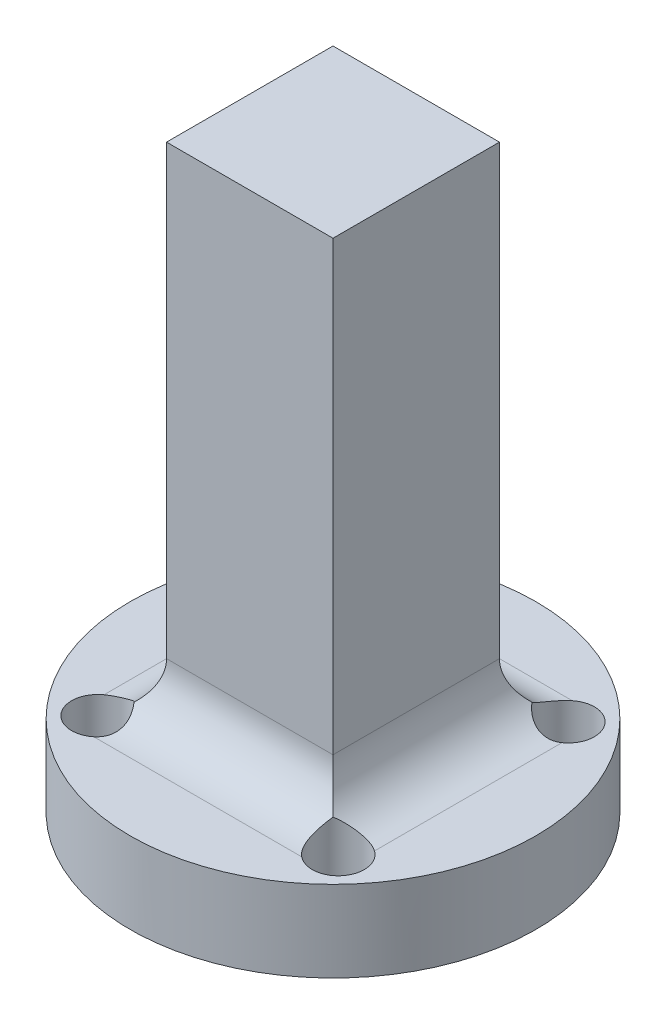
ISO-10303-21;
HEADER;
FILE_DESCRIPTION(('STEP AP214'),'2;1');
FILE_NAME('part.step','',(''),(''),'','','');
FILE_SCHEMA(('AUTOMOTIVE_DESIGN { 1 0 10303 214 1 1 1 1 }'));
ENDSEC;
DATA;
#1=APPLICATION_CONTEXT('core data for automotive mechanical design processes');
#2=APPLICATION_PROTOCOL_DEFINITION('international standard','automotive_design',2000,#1);
#3=PRODUCT_CONTEXT('',#1,'mechanical');
#4=PRODUCT('Part','Part','',(#3));
#5=PRODUCT_RELATED_PRODUCT_CATEGORY('part','',(#4));
#6=PRODUCT_DEFINITION_FORMATION('','',#4);
#7=PRODUCT_DEFINITION_CONTEXT('part definition',#1,'design');
#8=PRODUCT_DEFINITION('design','',#6,#7);
#9=PRODUCT_DEFINITION_SHAPE('','',#8);
#10=(LENGTH_UNIT() NAMED_UNIT(*) SI_UNIT(.MILLI.,.METRE.));
#11=(NAMED_UNIT(*) PLANE_ANGLE_UNIT() SI_UNIT($,.RADIAN.));
#12=(NAMED_UNIT(*) SI_UNIT($,.STERADIAN.) SOLID_ANGLE_UNIT());
#13=UNCERTAINTY_MEASURE_WITH_UNIT(LENGTH_MEASURE(1.E-05),#10,'distance_accuracy_value','');
#14=(GEOMETRIC_REPRESENTATION_CONTEXT(3) GLOBAL_UNCERTAINTY_ASSIGNED_CONTEXT((#13)) GLOBAL_UNIT_ASSIGNED_CONTEXT((#10,
#11,#12)) REPRESENTATION_CONTEXT('',''));
#15=CARTESIAN_POINT('',(0.,0.,0.));
#16=DIRECTION('',(0.,0.,1.));
#17=DIRECTION('',(1.,0.,0.));
#18=AXIS2_PLACEMENT_3D('',#15,#16,#17);
#19=CARTESIAN_POINT('',(-5.78230037987863,2.,5.5285624096012));
#20=DIRECTION('',(0.,-1.,0.));
#21=DIRECTION('',(0.,0.,-1.));
#22=AXIS2_PLACEMENT_3D('',#19,#20,#21);
#23=CYLINDRICAL_SURFACE('',#22,1.25);
#24=CARTESIAN_POINT('',(-4.99565623672356,2.,6.5));
#25=CARTESIAN_POINT('',(-4.96985241931316,2.00000089447943,6.47910472523633));
#26=CARTESIAN_POINT('',(-4.94489210961133,2.00026232413753,6.45718892597103));
#27=CARTESIAN_POINT('',(-4.89679623587124,2.00146362308063,6.41144708926393));
#28=CARTESIAN_POINT('',(-4.87366105928872,2.00240363599378,6.38762064836711));
#29=CARTESIAN_POINT('',(-4.80724898546659,2.0064755535342,6.3135226385259));
#30=CARTESIAN_POINT('',(-4.76692646416761,2.01085886778409,6.26060067381273));
#31=CARTESIAN_POINT('',(-4.69531472718749,2.02408136894734,6.1493302218496));
#32=CARTESIAN_POINT('',(-4.66404409457847,2.03292962148232,6.09097089191573));
#33=CARTESIAN_POINT('',(-4.61137937340525,2.05585298098622,5.9709759697923));
#34=CARTESIAN_POINT('',(-4.58997558676677,2.06992293090915,5.90934366134894));
#35=CARTESIAN_POINT('',(-4.55761996478952,2.10312794995213,5.78659920395023));
#36=CARTESIAN_POINT('',(-4.54640698499665,2.12211941240476,5.72551631633284));
#37=CARTESIAN_POINT('',(-4.53309400104578,2.16513330884828,5.60415045692307));
#38=CARTESIAN_POINT('',(-4.53099621670559,2.18915696683366,5.54386768354497));
#39=CARTESIAN_POINT('',(-4.53524091881413,2.24297118673254,5.42277139185705));
#40=CARTESIAN_POINT('',(-4.541996002102,2.27298426064981,5.36207289483123));
#41=CARTESIAN_POINT('',(-4.56356964264828,2.33717362021485,5.24433436149577));
#42=CARTESIAN_POINT('',(-4.57840332225154,2.37135762001575,5.18730141128557));
#43=CARTESIAN_POINT('',(-4.61857482386969,2.44995781209885,5.06701944074709));
#44=CARTESIAN_POINT('',(-4.64539765511264,2.49506894019033,5.00472952178863));
#45=CARTESIAN_POINT('',(-4.70727362014878,2.58820677948617,4.88733379238255));
#46=CARTESIAN_POINT('',(-4.7422841803158,2.63621748700351,4.83219303906777));
#47=CARTESIAN_POINT('',(-4.78070043003713,2.68505950821371,4.78070043003713));
#48=B_SPLINE_CURVE_WITH_KNOTS('',3,(#24,#25,#26,#27,#28,#29,#30,#31,#32,#33,#34,#35,#36,#37,#38,
#39,#40,#41,#42,#43,#44,#45,#46,#47),.UNSPECIFIED.,.F.,.F.,(4,2,2,2,2,2,2,2,2,2,2,4),(0.,
0.0995540797248653,0.199129237133235,0.398130421956338,0.597537294907428,0.796747751724287,
0.990696263075719,1.18469200393977,1.38805858887634,1.59180717127767,1.83531921738325,
2.07759217499231),.UNSPECIFIED.);
#49=CARTESIAN_POINT('',(-4.99565623672356,2.,6.5));
#50=VERTEX_POINT('',#49);
#51=CARTESIAN_POINT('',(-4.78070043003713,2.68505950821371,4.78070043003713));
#52=VERTEX_POINT('',#51);
#53=EDGE_CURVE('E84',#50,#52,#48,.T.);
#54=ORIENTED_EDGE('',*,*,#53,.T.);
#55=CARTESIAN_POINT('',(-4.78070043003713,2.6850595082137,4.78070043003713));
#56=CARTESIAN_POINT('',(-4.80840887173595,2.65879630191358,4.74362629248678));
#57=CARTESIAN_POINT('',(-4.8379610057044,2.63201997171276,4.70831049930148));
#58=CARTESIAN_POINT('',(-4.90065033943209,2.57807976399444,4.64125387019108));
#59=CARTESIAN_POINT('',(-4.93379117442149,2.55091551816711,4.6095167269938));
#60=CARTESIAN_POINT('',(-5.00369946260575,2.49673878442319,4.54957946762037));
#61=CARTESIAN_POINT('',(-5.04048673637458,2.46972807628843,4.52140081471615));
#62=CARTESIAN_POINT('',(-5.11737220333724,2.41660759674107,4.46906548107926));
#63=CARTESIAN_POINT('',(-5.15746844730047,2.3904973075882,4.44490645742981));
#64=CARTESIAN_POINT('',(-5.25941836219789,2.32838242018167,4.39113976092785));
#65=CARTESIAN_POINT('',(-5.32301865417972,2.29314091231148,4.3638861971722));
#66=CARTESIAN_POINT('',(-5.45583765770345,2.22729205813577,4.31992749241792));
#67=CARTESIAN_POINT('',(-5.52504155575247,2.19667306919968,4.30319550237738));
#68=CARTESIAN_POINT('',(-5.66826766108182,2.1411526880609,4.28165448136971));
#69=CARTESIAN_POINT('',(-5.74232624577992,2.11630283211407,4.27694942156137));
#70=CARTESIAN_POINT('',(-5.89216239854802,2.07377214302304,4.28115244890583));
#71=CARTESIAN_POINT('',(-5.9679395825944,2.05608972464961,4.29005752381093));
#72=CARTESIAN_POINT('',(-6.10757313423112,2.03011081438513,4.31980868342365));
#73=CARTESIAN_POINT('',(-6.17164351618286,2.02086194358416,4.33885680650206));
#74=CARTESIAN_POINT('',(-6.29630767958102,2.00752623387655,4.38718284928017));
#75=CARTESIAN_POINT('',(-6.3569071198215,2.003430750532,4.41644353251382));
#76=CARTESIAN_POINT('',(-6.42931071167543,2.00095631243706,4.45890526558474));
#77=CARTESIAN_POINT('',(-6.44372219105115,2.00059269598919,4.46775677548697));
#78=CARTESIAN_POINT('',(-6.47215201798542,2.00011506825862,4.48602307172673));
#79=CARTESIAN_POINT('',(-6.48617101490164,2.00000061728345,4.49543683565544));
#80=CARTESIAN_POINT('',(-6.5,2.,4.50513324484301));
#81=B_SPLINE_CURVE_WITH_KNOTS('',3,(#55,#56,#57,#58,#59,#60,#61,#62,#63,#64,#65,#66,#67,#68,#69,
#70,#71,#72,#73,#74,#75,#76,#77,#78,#79,#80),.UNSPECIFIED.,.F.,.F.,(4,2,2,2,2,2,2,2,2,2,2,2,4),
(0.,0.159569524294269,0.319302226415268,0.479956504565552,0.640516811784275,0.872473091903488,
1.10383503605461,1.33719041056538,1.57049414543997,1.77191796051389,1.97300344920204,
2.02374466510673,2.0743962671657),.UNSPECIFIED.);
#82=CARTESIAN_POINT('',(-6.5,2.,4.50513324484301));
#83=VERTEX_POINT('',#82);
#84=EDGE_CURVE('E76',#52,#83,#81,.T.);
#85=ORIENTED_EDGE('',*,*,#84,.T.);
#86=CARTESIAN_POINT('',(-5.78230037987863,2.,5.5285624096012));
#87=DIRECTION('',(0.,1.,0.));
#88=DIRECTION('',(0.,0.,1.));
#89=AXIS2_PLACEMENT_3D('',#86,#87,#88);
#90=CIRCLE('',#89,1.25);
#91=EDGE_CURVE('E203',#83,#50,#90,.T.);
#92=ORIENTED_EDGE('',*,*,#91,.T.);
#93=EDGE_LOOP('',(#54,#85,#92));
#94=FACE_BOUND('',#93,.T.);
#95=CARTESIAN_POINT('',(-5.78230037987863,-1.9,5.5285624096012));
#96=DIRECTION('',(0.,-1.,0.));
#97=DIRECTION('',(0.,0.,-1.));
#98=AXIS2_PLACEMENT_3D('',#95,#96,#97);
#99=CIRCLE('',#98,1.25);
#100=CARTESIAN_POINT('',(-5.78230037987863,-1.9,4.2785624096012));
#101=VERTEX_POINT('',#100);
#102=EDGE_CURVE('E369',#101,#101,#99,.T.);
#103=ORIENTED_EDGE('',*,*,#102,.T.);
#104=EDGE_LOOP('',(#103));
#105=FACE_BOUND('',#104,.T.);
#106=ADVANCED_FACE('F65',(#94,#105),#23,.F.);
#107=CARTESIAN_POINT('',(-5.78230037987863,2.,-5.5285624096012));
#108=DIRECTION('',(0.,-1.,0.));
#109=DIRECTION('',(0.,0.,-1.));
#110=AXIS2_PLACEMENT_3D('',#107,#108,#109);
#111=CYLINDRICAL_SURFACE('',#110,1.25);
#112=CARTESIAN_POINT('',(-5.78230037987863,2.,-5.5285624096012));
#113=DIRECTION('',(0.,1.,0.));
#114=DIRECTION('',(0.,0.,1.));
#115=AXIS2_PLACEMENT_3D('',#112,#113,#114);
#116=CIRCLE('',#115,1.25);
#117=CARTESIAN_POINT('',(-4.99565623672356,2.,-6.5));
#118=VERTEX_POINT('',#117);
#119=CARTESIAN_POINT('',(-6.5,2.,-4.50513324484301));
#120=VERTEX_POINT('',#119);
#121=EDGE_CURVE('E199',#118,#120,#116,.T.);
#122=ORIENTED_EDGE('',*,*,#121,.T.);
#123=CARTESIAN_POINT('',(-6.5,2.,-4.50513324484301));
#124=CARTESIAN_POINT('',(-6.47346985592118,1.99999915967387,-4.48652776902572));
#125=CARTESIAN_POINT('',(-6.44622516086038,2.00042297743986,-4.46896285745226));
#126=CARTESIAN_POINT('',(-6.39047635493586,2.00224437337088,-4.43600962820392));
#127=CARTESIAN_POINT('',(-6.36197206614527,2.00364208952068,-4.42062161933069));
#128=CARTESIAN_POINT('',(-6.27498608709423,2.00947259307293,-4.37794729015298));
#129=CARTESIAN_POINT('',(-6.21489239534751,2.01554146024035,-4.3540535512046));
#130=CARTESIAN_POINT('',(-6.09233253755923,2.03268484520465,-4.31591619054792));
#131=CARTESIAN_POINT('',(-6.02986298598155,2.04376677148884,-4.30168692950077));
#132=CARTESIAN_POINT('',(-5.9046259790634,2.0710836672523,-4.28295276003952));
#133=CARTESIAN_POINT('',(-5.84185863368645,2.08731686137717,-4.27844450550378));
#134=CARTESIAN_POINT('',(-5.71788284696649,2.12460884989841,-4.27868503691617));
#135=CARTESIAN_POINT('',(-5.65667317360885,2.14566368998921,-4.28342626105152));
#136=CARTESIAN_POINT('',(-5.53714948311199,2.19196315765343,-4.30134672165651));
#137=CARTESIAN_POINT('',(-5.47883704197607,2.21721003383421,-4.31453049761036));
#138=CARTESIAN_POINT('',(-5.36020482108183,2.27387631522092,-4.3501891738689));
#139=CARTESIAN_POINT('',(-5.30031232742372,2.30566507094854,-4.37349119763462));
#140=CARTESIAN_POINT('',(-5.18601322936874,2.37213169209834,-4.4281242321797));
#141=CARTESIAN_POINT('',(-5.13161332483706,2.40681299394012,-4.45946488745645));
#142=CARTESIAN_POINT('',(-5.02238745452157,2.48218397431905,-4.53361847206596));
#143=CARTESIAN_POINT('',(-4.96834183821837,2.52308607962147,-4.5773711400011));
#144=CARTESIAN_POINT('',(-4.89334510624871,2.5843530054958,-4.64910134380195));
#145=CARTESIAN_POINT('',(-4.86938267925849,2.60473710962755,-4.6739955542103));
#146=CARTESIAN_POINT('',(-4.82350016115877,2.64519941120578,-4.72582059294778));
#147=CARTESIAN_POINT('',(-4.8015797657085,2.66527765386301,-4.752751116701));
#148=CARTESIAN_POINT('',(-4.78070043003713,2.68505950821371,-4.78070043003713));
#149=B_SPLINE_CURVE_WITH_KNOTS('',3,(#123,#124,#125,#126,#127,#128,#129,#130,#131,#132,#133,
#134,#135,#136,#137,#138,#139,#140,#141,#142,#143,#144,#145,#146,#147,#148),.UNSPECIFIED.,.F.,
.F.,(4,2,2,2,2,2,2,2,2,2,2,2,4),(0.,0.0971578028756104,0.194329374151897,0.388170504885556,
0.582299041956374,0.776360746291051,0.970263864030677,1.16427132937533,1.37855765395605,
1.59310228502474,1.83419666646022,1.95446237006167,2.0747101207022),.UNSPECIFIED.);
#150=CARTESIAN_POINT('',(-4.78070043003713,2.68505950821371,-4.78070043003713));
#151=VERTEX_POINT('',#150);
#152=EDGE_CURVE('E12',#120,#151,#149,.T.);
#153=ORIENTED_EDGE('',*,*,#152,.T.);
#154=CARTESIAN_POINT('',(-4.78070043003713,2.68505950821371,-4.78070043003713));
#155=CARTESIAN_POINT('',(-4.7554667699924,2.65302295406572,-4.81451074484394));
#156=CARTESIAN_POINT('',(-4.73174291267654,2.62135568573,-4.84984083820133));
#157=CARTESIAN_POINT('',(-4.68761679142749,2.55907969023089,-4.92356249315505));
#158=CARTESIAN_POINT('',(-4.66722274824854,2.52847372555862,-4.96196129322965));
#159=CARTESIAN_POINT('',(-4.63004971128542,2.46858287594194,-5.04196723242474));
#160=CARTESIAN_POINT('',(-4.61329810952907,2.43930922764233,-5.08359568885544));
#161=CARTESIAN_POINT('',(-4.58409895645601,2.3827829701666,-5.16957224583006));
#162=CARTESIAN_POINT('',(-4.5716466233554,2.35552814227835,-5.21391725984838));
#163=CARTESIAN_POINT('',(-4.54802128649754,2.29426268012773,-5.32112572637707));
#164=CARTESIAN_POINT('',(-4.5388346675408,2.26124253389149,-5.38502177005327));
#165=CARTESIAN_POINT('',(-4.5306572033836,2.20075829143567,-5.51579658555106));
#166=CARTESIAN_POINT('',(-4.53163115421173,2.17327534735728,-5.5826642598322));
#167=CARTESIAN_POINT('',(-4.54486599031942,2.12433577998474,-5.71805970344683));
#168=CARTESIAN_POINT('',(-4.55720431902192,2.10292182517176,-5.78659571827544));
#169=CARTESIAN_POINT('',(-4.59384411854983,2.06665684027566,-5.92226922301116));
#170=CARTESIAN_POINT('',(-4.61815195034547,2.05180930776811,-5.98940594949696));
#171=CARTESIAN_POINT('',(-4.67553311326064,2.02938169553732,-6.11317867942084));
#172=CARTESIAN_POINT('',(-4.70755500752341,2.02124542735119,-6.1702064542832));
#173=CARTESIAN_POINT('',(-4.78036245552585,2.00920462103206,-6.27881868456151));
#174=CARTESIAN_POINT('',(-4.82114042823285,2.00529643977555,-6.33040779154143));
#175=CARTESIAN_POINT('',(-4.88589668879924,2.00189465676992,-6.4002549751359));
#176=CARTESIAN_POINT('',(-4.90687251425026,2.00115568971361,-6.42131688078703));
#177=CARTESIAN_POINT('',(-4.95022865822967,2.00020939243347,-6.46185426086648));
#178=CARTESIAN_POINT('',(-4.97260573414089,2.00000087811713,-6.4813331745606));
#179=CARTESIAN_POINT('',(-4.99565623672356,2.,-6.5));
#180=B_SPLINE_CURVE_WITH_KNOTS('',3,(#154,#155,#156,#157,#158,#159,#160,#161,#162,#163,#164,
#165,#166,#167,#168,#169,#170,#171,#172,#173,#174,#175,#176,#177,#178,#179),.UNSPECIFIED.,.F.,
.F.,(4,2,2,2,2,2,2,2,2,2,2,2,4),(0.,0.158917221313353,0.318221036646506,0.478684323807531,
0.638968559250836,0.85556373015362,1.07140869995011,1.28873553197597,1.50617798316154,
1.70297418622392,1.89960068480502,1.98873789264574,2.07767595044729),.UNSPECIFIED.);
#181=EDGE_CURVE('E243',#151,#118,#180,.T.);
#182=ORIENTED_EDGE('',*,*,#181,.T.);
#183=EDGE_LOOP('',(#122,#153,#182));
#184=FACE_BOUND('',#183,.T.);
#185=CARTESIAN_POINT('',(-5.78230037987863,-1.9,-5.5285624096012));
#186=DIRECTION('',(0.,-1.,0.));
#187=DIRECTION('',(0.,0.,-1.));
#188=AXIS2_PLACEMENT_3D('',#185,#186,#187);
#189=CIRCLE('',#188,1.25);
#190=CARTESIAN_POINT('',(-5.78230037987863,-1.9,-6.7785624096012));
#191=VERTEX_POINT('',#190);
#192=EDGE_CURVE('E338',#191,#191,#189,.T.);
#193=ORIENTED_EDGE('',*,*,#192,.T.);
#194=EDGE_LOOP('',(#193));
#195=FACE_BOUND('',#194,.T.);
#196=ADVANCED_FACE('F303',(#184,#195),#111,.F.);
#197=CARTESIAN_POINT('',(5.78230037987863,2.,5.5285624096012));
#198=DIRECTION('',(0.,-1.,0.));
#199=DIRECTION('',(0.,0.,-1.));
#200=AXIS2_PLACEMENT_3D('',#197,#198,#199);
#201=CYLINDRICAL_SURFACE('',#200,1.25);
#202=CARTESIAN_POINT('',(6.5,2.,4.50513324484301));
#203=CARTESIAN_POINT('',(6.47346985592118,1.99999915967387,4.48652776902572));
#204=CARTESIAN_POINT('',(6.44622516086038,2.00042297743986,4.46896285745226));
#205=CARTESIAN_POINT('',(6.39047635493586,2.00224437337088,4.43600962820392));
#206=CARTESIAN_POINT('',(6.36197206614528,2.00364208952068,4.42062161933069));
#207=CARTESIAN_POINT('',(6.27498608709423,2.00947259307293,4.37794729015298));
#208=CARTESIAN_POINT('',(6.21489239534751,2.01554146024035,4.35405355120461));
#209=CARTESIAN_POINT('',(6.09233253755924,2.03268484520465,4.31591619054792));
#210=CARTESIAN_POINT('',(6.02986298598156,2.04376677148884,4.30168692950077));
#211=CARTESIAN_POINT('',(5.90462597906341,2.0710836672523,4.28295276003952));
#212=CARTESIAN_POINT('',(5.84185863368645,2.08731686137717,4.27844450550378));
#213=CARTESIAN_POINT('',(5.71788284696649,2.12460884989841,4.27868503691617));
#214=CARTESIAN_POINT('',(5.65667317360885,2.14566368998921,4.28342626105152));
#215=CARTESIAN_POINT('',(5.53714948311199,2.19196315765343,4.30134672165651));
#216=CARTESIAN_POINT('',(5.47883704197608,2.2172100338342,4.31453049761036));
#217=CARTESIAN_POINT('',(5.36020482108184,2.27387631522092,4.3501891738689));
#218=CARTESIAN_POINT('',(5.30031232742373,2.30566507094854,4.37349119763462));
#219=CARTESIAN_POINT('',(5.18601322936874,2.37213169209833,4.4281242321797));
#220=CARTESIAN_POINT('',(5.13161332483706,2.40681299394012,4.45946488745645));
#221=CARTESIAN_POINT('',(5.02238745452157,2.48218397431905,4.53361847206595));
#222=CARTESIAN_POINT('',(4.96834183821837,2.52308607962147,4.5773711400011));
#223=CARTESIAN_POINT('',(4.89334510624872,2.5843530054958,4.64910134380195));
#224=CARTESIAN_POINT('',(4.86938267925849,2.60473710962755,4.67399555421029));
#225=CARTESIAN_POINT('',(4.82350016115877,2.64519941120578,4.72582059294778));
#226=CARTESIAN_POINT('',(4.8015797657085,2.66527765386301,4.752751116701));
#227=CARTESIAN_POINT('',(4.78070043003713,2.68505950821371,4.78070043003712));
#228=B_SPLINE_CURVE_WITH_KNOTS('',3,(#202,#203,#204,#205,#206,#207,#208,#209,#210,#211,#212,
#213,#214,#215,#216,#217,#218,#219,#220,#221,#222,#223,#224,#225,#226,#227),.UNSPECIFIED.,.F.,
.F.,(4,2,2,2,2,2,2,2,2,2,2,2,4),(0.,0.0971578028756097,0.194329374151895,0.388170504885555,
0.582299041956372,0.776360746291049,0.970263864030676,1.16427132937533,1.37855765395604,
1.59310228502474,1.83419666646022,1.95446237006167,2.0747101207022),.UNSPECIFIED.);
#229=CARTESIAN_POINT('',(6.5,2.,4.50513324484301));
#230=VERTEX_POINT('',#229);
#231=CARTESIAN_POINT('',(4.78070043003713,2.68505950821371,4.78070043003712));
#232=VERTEX_POINT('',#231);
#233=EDGE_CURVE('E92',#230,#232,#228,.T.);
#234=ORIENTED_EDGE('',*,*,#233,.T.);
#235=CARTESIAN_POINT('',(4.78070043003713,2.68505950821371,4.78070043003712));
#236=CARTESIAN_POINT('',(4.7554667699924,2.65302295406572,4.81451074484394));
#237=CARTESIAN_POINT('',(4.73174291267655,2.62135568573,4.84984083820132));
#238=CARTESIAN_POINT('',(4.68761679142749,2.55907969023089,4.92356249315504));
#239=CARTESIAN_POINT('',(4.66722274824854,2.52847372555862,4.96196129322964));
#240=CARTESIAN_POINT('',(4.63004971128542,2.46858287594195,5.04196723242474));
#241=CARTESIAN_POINT('',(4.61329810952907,2.43930922764233,5.08359568885543));
#242=CARTESIAN_POINT('',(4.58409895645601,2.3827829701666,5.16957224583006));
#243=CARTESIAN_POINT('',(4.5716466233554,2.35552814227835,5.21391725984838));
#244=CARTESIAN_POINT('',(4.54802128649754,2.29426268012773,5.32112572637707));
#245=CARTESIAN_POINT('',(4.5388346675408,2.26124253389149,5.38502177005327));
#246=CARTESIAN_POINT('',(4.53065720338361,2.20075829143567,5.51579658555106));
#247=CARTESIAN_POINT('',(4.53163115421173,2.17327534735728,5.5826642598322));
#248=CARTESIAN_POINT('',(4.54486599031942,2.12433577998474,5.71805970344683));
#249=CARTESIAN_POINT('',(4.55720431902191,2.10292182517176,5.78659571827544));
#250=CARTESIAN_POINT('',(4.59384411854983,2.06665684027567,5.92226922301115));
#251=CARTESIAN_POINT('',(4.61815195034547,2.05180930776811,5.98940594949695));
#252=CARTESIAN_POINT('',(4.67553311326064,2.02938169553732,6.11317867942084));
#253=CARTESIAN_POINT('',(4.70755500752341,2.02124542735119,6.1702064542832));
#254=CARTESIAN_POINT('',(4.78036245552585,2.00920462103206,6.27881868456151));
#255=CARTESIAN_POINT('',(4.82114042823284,2.00529643977555,6.33040779154143));
#256=CARTESIAN_POINT('',(4.88589668879924,2.00189465676992,6.4002549751359));
#257=CARTESIAN_POINT('',(4.90687251425025,2.00115568971361,6.42131688078703));
#258=CARTESIAN_POINT('',(4.95022865822967,2.00020939243347,6.46185426086648));
#259=CARTESIAN_POINT('',(4.97260573414089,2.00000087811713,6.48133317456059));
#260=CARTESIAN_POINT('',(4.99565623672356,2.,6.5));
#261=B_SPLINE_CURVE_WITH_KNOTS('',3,(#235,#236,#237,#238,#239,#240,#241,#242,#243,#244,#245,
#246,#247,#248,#249,#250,#251,#252,#253,#254,#255,#256,#257,#258,#259,#260),.UNSPECIFIED.,.F.,
.F.,(4,2,2,2,2,2,2,2,2,2,2,2,4),(0.,0.158917221313352,0.318221036646504,0.478684323807529,
0.638968559250835,0.85556373015362,1.07140869995011,1.28873553197597,1.50617798316154,
1.70297418622392,1.89960068480502,1.98873789264574,2.07767595044729),.UNSPECIFIED.);
#262=CARTESIAN_POINT('',(4.99565623672356,2.,6.5));
#263=VERTEX_POINT('',#262);
#264=EDGE_CURVE('E270',#232,#263,#261,.T.);
#265=ORIENTED_EDGE('',*,*,#264,.T.);
#266=CARTESIAN_POINT('',(5.78230037987863,2.,5.5285624096012));
#267=DIRECTION('',(0.,1.,0.));
#268=DIRECTION('',(0.,0.,1.));
#269=AXIS2_PLACEMENT_3D('',#266,#267,#268);
#270=CIRCLE('',#269,1.25);
#271=EDGE_CURVE('E196',#263,#230,#270,.T.);
#272=ORIENTED_EDGE('',*,*,#271,.T.);
#273=EDGE_LOOP('',(#234,#265,#272));
#274=FACE_BOUND('',#273,.T.);
#275=CARTESIAN_POINT('',(5.78230037987863,-1.9,5.5285624096012));
#276=DIRECTION('',(0.,-1.,0.));
#277=DIRECTION('',(0.,0.,-1.));
#278=AXIS2_PLACEMENT_3D('',#275,#276,#277);
#279=CIRCLE('',#278,1.25);
#280=CARTESIAN_POINT('',(5.78230037987863,-1.9,4.2785624096012));
#281=VERTEX_POINT('',#280);
#282=EDGE_CURVE('E365',#281,#281,#279,.T.);
#283=ORIENTED_EDGE('',*,*,#282,.T.);
#284=EDGE_LOOP('',(#283));
#285=FACE_BOUND('',#284,.T.);
#286=ADVANCED_FACE('F258',(#274,#285),#201,.F.);
#287=CARTESIAN_POINT('',(5.78230037987863,2.,-5.5285624096012));
#288=DIRECTION('',(0.,-1.,0.));
#289=DIRECTION('',(0.,0.,-1.));
#290=AXIS2_PLACEMENT_3D('',#287,#288,#289);
#291=CYLINDRICAL_SURFACE('',#290,1.25);
#292=CARTESIAN_POINT('',(5.78230037987863,2.,-5.5285624096012));
#293=DIRECTION('',(0.,1.,0.));
#294=DIRECTION('',(0.,0.,1.));
#295=AXIS2_PLACEMENT_3D('',#292,#293,#294);
#296=CIRCLE('',#295,1.25);
#297=CARTESIAN_POINT('',(6.5,2.,-4.50513324484301));
#298=VERTEX_POINT('',#297);
#299=CARTESIAN_POINT('',(4.99565623672356,2.,-6.5));
#300=VERTEX_POINT('',#299);
#301=EDGE_CURVE('E159',#298,#300,#296,.T.);
#302=ORIENTED_EDGE('',*,*,#301,.T.);
#303=CARTESIAN_POINT('',(4.99565623672356,2.,-6.5));
#304=CARTESIAN_POINT('',(4.96985241931317,2.00000089447943,-6.47910472523633));
#305=CARTESIAN_POINT('',(4.94489210961134,2.00026232413753,-6.45718892597103));
#306=CARTESIAN_POINT('',(4.89679623587125,2.00146362308063,-6.41144708926394));
#307=CARTESIAN_POINT('',(4.87366105928872,2.00240363599378,-6.38762064836712));
#308=CARTESIAN_POINT('',(4.8072489854666,2.0064755535342,-6.3135226385259));
#309=CARTESIAN_POINT('',(4.76692646416761,2.01085886778409,-6.26060067381273));
#310=CARTESIAN_POINT('',(4.69531472718749,2.02408136894734,-6.1493302218496));
#311=CARTESIAN_POINT('',(4.66404409457848,2.03292962148232,-6.09097089191574));
#312=CARTESIAN_POINT('',(4.61137937340525,2.05585298098622,-5.97097596979231));
#313=CARTESIAN_POINT('',(4.58997558676677,2.06992293090915,-5.90934366134894));
#314=CARTESIAN_POINT('',(4.55761996478952,2.10312794995213,-5.78659920395023));
#315=CARTESIAN_POINT('',(4.54640698499665,2.12211941240476,-5.72551631633284));
#316=CARTESIAN_POINT('',(4.53309400104578,2.16513330884828,-5.60415045692307));
#317=CARTESIAN_POINT('',(4.53099621670559,2.18915696683366,-5.54386768354497));
#318=CARTESIAN_POINT('',(4.53524091881413,2.24297118673254,-5.42277139185706));
#319=CARTESIAN_POINT('',(4.541996002102,2.27298426064981,-5.36207289483123));
#320=CARTESIAN_POINT('',(4.56356964264828,2.33717362021484,-5.24433436149577));
#321=CARTESIAN_POINT('',(4.57840332225154,2.37135762001575,-5.18730141128557));
#322=CARTESIAN_POINT('',(4.61857482386969,2.44995781209885,-5.0670194407471));
#323=CARTESIAN_POINT('',(4.64539765511264,2.49506894019032,-5.00472952178863));
#324=CARTESIAN_POINT('',(4.70727362014878,2.58820677948617,-4.88733379238255));
#325=CARTESIAN_POINT('',(4.7422841803158,2.6362174870035,-4.83219303906777));
#326=CARTESIAN_POINT('',(4.78070043003713,2.68505950821371,-4.78070043003713));
#327=B_SPLINE_CURVE_WITH_KNOTS('',3,(#303,#304,#305,#306,#307,#308,#309,#310,#311,#312,#313,
#314,#315,#316,#317,#318,#319,#320,#321,#322,#323,#324,#325,#326),.UNSPECIFIED.,.F.,.F.,(4,2,2,
2,2,2,2,2,2,2,2,4),(0.,0.0995540797248665,0.199129237133235,0.398130421956338,0.597537294907426,
0.796747751724286,0.990696263075718,1.18469200393977,1.38805858887634,1.59180717127767,
1.83531921738325,2.07759217499231),.UNSPECIFIED.);
#328=CARTESIAN_POINT('',(4.78070043003713,2.68505950821371,-4.78070043003713));
#329=VERTEX_POINT('',#328);
#330=EDGE_CURVE('E234',#300,#329,#327,.T.);
#331=ORIENTED_EDGE('',*,*,#330,.T.);
#332=CARTESIAN_POINT('',(4.78070043003713,2.68505950821371,-4.78070043003713));
#333=CARTESIAN_POINT('',(4.80840887173595,2.65879630191358,-4.74362629248678));
#334=CARTESIAN_POINT('',(4.8379610057044,2.63201997171276,-4.70831049930148));
#335=CARTESIAN_POINT('',(4.90065033943209,2.57807976399444,-4.64125387019108));
#336=CARTESIAN_POINT('',(4.93379117442149,2.55091551816711,-4.6095167269938));
#337=CARTESIAN_POINT('',(5.00369946260575,2.49673878442319,-4.54957946762037));
#338=CARTESIAN_POINT('',(5.04048673637458,2.46972807628843,-4.52140081471615));
#339=CARTESIAN_POINT('',(5.11737220333724,2.41660759674108,-4.46906548107926));
#340=CARTESIAN_POINT('',(5.15746844730047,2.3904973075882,-4.44490645742981));
#341=CARTESIAN_POINT('',(5.25941836219789,2.32838242018168,-4.39113976092785));
#342=CARTESIAN_POINT('',(5.32301865417972,2.29314091231148,-4.3638861971722));
#343=CARTESIAN_POINT('',(5.45583765770345,2.22729205813577,-4.31992749241792));
#344=CARTESIAN_POINT('',(5.52504155575247,2.19667306919968,-4.30319550237738));
#345=CARTESIAN_POINT('',(5.66826766108181,2.1411526880609,-4.28165448136971));
#346=CARTESIAN_POINT('',(5.74232624577992,2.11630283211407,-4.27694942156137));
#347=CARTESIAN_POINT('',(5.89216239854802,2.07377214302304,-4.28115244890583));
#348=CARTESIAN_POINT('',(5.9679395825944,2.05608972464961,-4.29005752381093));
#349=CARTESIAN_POINT('',(6.10757313423112,2.03011081438513,-4.31980868342365));
#350=CARTESIAN_POINT('',(6.17164351618286,2.02086194358416,-4.33885680650206));
#351=CARTESIAN_POINT('',(6.29630767958102,2.00752623387655,-4.38718284928017));
#352=CARTESIAN_POINT('',(6.3569071198215,2.003430750532,-4.41644353251382));
#353=CARTESIAN_POINT('',(6.42931071167543,2.00095631243706,-4.45890526558474));
#354=CARTESIAN_POINT('',(6.44372219105115,2.00059269598919,-4.46775677548697));
#355=CARTESIAN_POINT('',(6.47215201798542,2.00011506825862,-4.48602307172672));
#356=CARTESIAN_POINT('',(6.48617101490164,2.00000061728345,-4.49543683565543));
#357=CARTESIAN_POINT('',(6.5,2.,-4.50513324484301));
#358=B_SPLINE_CURVE_WITH_KNOTS('',3,(#332,#333,#334,#335,#336,#337,#338,#339,#340,#341,#342,
#343,#344,#345,#346,#347,#348,#349,#350,#351,#352,#353,#354,#355,#356,#357),.UNSPECIFIED.,.F.,
.F.,(4,2,2,2,2,2,2,2,2,2,2,2,4),(0.,0.159569524294268,0.319302226415268,0.479956504565552,
0.640516811784275,0.872473091903488,1.10383503605461,1.33719041056538,1.57049414543997,
1.77191796051389,1.97300344920205,2.02374466510673,2.0743962671657),.UNSPECIFIED.);
#359=EDGE_CURVE('E263',#329,#298,#358,.T.);
#360=ORIENTED_EDGE('',*,*,#359,.T.);
#361=EDGE_LOOP('',(#302,#331,#360));
#362=FACE_BOUND('',#361,.T.);
#363=CARTESIAN_POINT('',(5.78230037987863,-1.9,-5.5285624096012));
#364=DIRECTION('',(0.,-1.,0.));
#365=DIRECTION('',(0.,0.,-1.));
#366=AXIS2_PLACEMENT_3D('',#363,#364,#365);
#367=CIRCLE('',#366,1.25);
#368=CARTESIAN_POINT('',(5.78230037987863,-1.9,-6.7785624096012));
#369=VERTEX_POINT('',#368);
#370=EDGE_CURVE('E361',#369,#369,#367,.T.);
#371=ORIENTED_EDGE('',*,*,#370,.T.);
#372=EDGE_LOOP('',(#371));
#373=FACE_BOUND('',#372,.T.);
#374=ADVANCED_FACE('F253',(#362,#373),#291,.F.);
#375=CARTESIAN_POINT('',(0.,2.,0.));
#376=DIRECTION('',(0.,-1.,0.));
#377=DIRECTION('',(0.,0.,-1.));
#378=AXIS2_PLACEMENT_3D('',#375,#376,#377);
#379=CYLINDRICAL_SURFACE('',#378,9.75);
#380=CARTESIAN_POINT('',(0.,2.,0.));
#381=DIRECTION('',(0.,1.,0.));
#382=DIRECTION('',(0.,0.,1.));
#383=AXIS2_PLACEMENT_3D('',#380,#381,#382);
#384=CIRCLE('',#383,9.75);
#385=CARTESIAN_POINT('',(0.,2.,9.75));
#386=VERTEX_POINT('',#385);
#387=EDGE_CURVE('E206',#386,#386,#384,.T.);
#388=ORIENTED_EDGE('',*,*,#387,.F.);
#389=EDGE_LOOP('',(#388));
#390=FACE_BOUND('',#389,.T.);
#391=CARTESIAN_POINT('',(0.,-1.9,0.));
#392=DIRECTION('',(0.,-1.,0.));
#393=DIRECTION('',(0.,0.,-1.));
#394=AXIS2_PLACEMENT_3D('',#391,#392,#393);
#395=CIRCLE('',#394,9.75);
#396=CARTESIAN_POINT('',(0.,-1.9,-9.75));
#397=VERTEX_POINT('',#396);
#398=EDGE_CURVE('E170',#397,#397,#395,.T.);
#399=ORIENTED_EDGE('',*,*,#398,.F.);
#400=EDGE_LOOP('',(#399));
#401=FACE_BOUND('',#400,.T.);
#402=ADVANCED_FACE('F257',(#390,#401),#379,.T.);
#403=CARTESIAN_POINT('',(0.,2.,0.));
#404=DIRECTION('',(0.,1.,0.));
#405=DIRECTION('',(0.,0.,1.));
#406=AXIS2_PLACEMENT_3D('',#403,#404,#405);
#407=PLANE('',#406);
#408=ORIENTED_EDGE('',*,*,#121,.F.);
#409=DIRECTION('',(1.,0.,0.));
#410=VECTOR('',#409,1.);
#411=CARTESIAN_POINT('',(4.,2.,-6.5));
#412=LINE('',#411,#410);
#413=EDGE_CURVE('E219',#118,#300,#412,.T.);
#414=ORIENTED_EDGE('',*,*,#413,.T.);
#415=ORIENTED_EDGE('',*,*,#301,.F.);
#416=DIRECTION('',(0.,0.,1.));
#417=VECTOR('',#416,1.);
#418=CARTESIAN_POINT('',(6.5,2.,4.));
#419=LINE('',#418,#417);
#420=EDGE_CURVE('E216',#298,#230,#419,.T.);
#421=ORIENTED_EDGE('',*,*,#420,.T.);
#422=ORIENTED_EDGE('',*,*,#271,.F.);
#423=DIRECTION('',(1.,0.,0.));
#424=VECTOR('',#423,1.);
#425=CARTESIAN_POINT('',(0.,2.,6.5));
#426=LINE('',#425,#424);
#427=EDGE_CURVE('E213',#263,#50,#426,.F.);
#428=ORIENTED_EDGE('',*,*,#427,.T.);
#429=ORIENTED_EDGE('',*,*,#91,.F.);
#430=DIRECTION('',(0.,0.,1.));
#431=VECTOR('',#430,1.);
#432=CARTESIAN_POINT('',(-6.5,2.,0.));
#433=LINE('',#432,#431);
#434=EDGE_CURVE('E210',#83,#120,#433,.F.);
#435=ORIENTED_EDGE('',*,*,#434,.T.);
#436=EDGE_LOOP('',(#408,#414,#415,#421,#422,#428,#429,#435));
#437=FACE_BOUND('',#436,.T.);
#438=ORIENTED_EDGE('',*,*,#387,.T.);
#439=EDGE_LOOP('',(#438));
#440=FACE_BOUND('',#439,.T.);
#441=ADVANCED_FACE('F328',(#437,#440),#407,.T.);
#442=CARTESIAN_POINT('',(0.,26.,-4.));
#443=DIRECTION('',(0.,0.,-1.));
#444=DIRECTION('',(-1.,0.,0.));
#445=AXIS2_PLACEMENT_3D('',#442,#443,#444);
#446=PLANE('',#445);
#447=DIRECTION('',(0.,-1.,0.));
#448=VECTOR('',#447,1.);
#449=CARTESIAN_POINT('',(4.,26.,-4.));
#450=LINE('',#449,#448);
#451=CARTESIAN_POINT('',(4.,26.,-4.));
#452=VERTEX_POINT('',#451);
#453=CARTESIAN_POINT('',(4.,4.5,-4.));
#454=VERTEX_POINT('',#453);
#455=EDGE_CURVE('E147',#452,#454,#450,.T.);
#456=ORIENTED_EDGE('',*,*,#455,.T.);
#457=DIRECTION('',(1.,0.,0.));
#458=VECTOR('',#457,1.);
#459=CARTESIAN_POINT('',(-4.,4.5,-4.));
#460=LINE('',#459,#458);
#461=CARTESIAN_POINT('',(-4.,4.5,-4.));
#462=VERTEX_POINT('',#461);
#463=EDGE_CURVE('E223',#454,#462,#460,.F.);
#464=ORIENTED_EDGE('',*,*,#463,.T.);
#465=DIRECTION('',(0.,-1.,0.));
#466=VECTOR('',#465,1.);
#467=CARTESIAN_POINT('',(-4.,26.,-4.));
#468=LINE('',#467,#466);
#469=CARTESIAN_POINT('',(-4.,26.,-4.));
#470=VERTEX_POINT('',#469);
#471=EDGE_CURVE('E160',#470,#462,#468,.T.);
#472=ORIENTED_EDGE('',*,*,#471,.F.);
#473=DIRECTION('',(1.,0.,0.));
#474=VECTOR('',#473,1.);
#475=CARTESIAN_POINT('',(0.,26.,-4.));
#476=LINE('',#475,#474);
#477=EDGE_CURVE('E165',#470,#452,#476,.T.);
#478=ORIENTED_EDGE('',*,*,#477,.T.);
#479=EDGE_LOOP('',(#456,#464,#472,#478));
#480=FACE_BOUND('',#479,.T.);
#481=ADVANCED_FACE('F172',(#480),#446,.T.);
#482=CARTESIAN_POINT('',(4.,26.,0.));
#483=DIRECTION('',(1.,0.,0.));
#484=DIRECTION('',(0.,0.,-1.));
#485=AXIS2_PLACEMENT_3D('',#482,#483,#484);
#486=PLANE('',#485);
#487=DIRECTION('',(0.,-1.,0.));
#488=VECTOR('',#487,1.);
#489=CARTESIAN_POINT('',(4.,26.,4.));
#490=LINE('',#489,#488);
#491=CARTESIAN_POINT('',(4.,26.,4.));
#492=VERTEX_POINT('',#491);
#493=CARTESIAN_POINT('',(4.,4.5,4.));
#494=VERTEX_POINT('',#493);
#495=EDGE_CURVE('E184',#492,#494,#490,.T.);
#496=ORIENTED_EDGE('',*,*,#495,.T.);
#497=DIRECTION('',(0.,0.,1.));
#498=VECTOR('',#497,1.);
#499=CARTESIAN_POINT('',(4.,4.5,-4.));
#500=LINE('',#499,#498);
#501=EDGE_CURVE('E153',#494,#454,#500,.F.);
#502=ORIENTED_EDGE('',*,*,#501,.T.);
#503=ORIENTED_EDGE('',*,*,#455,.F.);
#504=DIRECTION('',(0.,0.,1.));
#505=VECTOR('',#504,1.);
#506=CARTESIAN_POINT('',(4.,26.,0.));
#507=LINE('',#506,#505);
#508=EDGE_CURVE('E151',#452,#492,#507,.T.);
#509=ORIENTED_EDGE('',*,*,#508,.T.);
#510=EDGE_LOOP('',(#496,#502,#503,#509));
#511=FACE_BOUND('',#510,.T.);
#512=ADVANCED_FACE('F150',(#511),#486,.T.);
#513=CARTESIAN_POINT('',(0.,26.,4.));
#514=DIRECTION('',(0.,0.,-1.));
#515=DIRECTION('',(-1.,0.,0.));
#516=AXIS2_PLACEMENT_3D('',#513,#514,#515);
#517=PLANE('',#516);
#518=DIRECTION('',(0.,-1.,0.));
#519=VECTOR('',#518,1.);
#520=CARTESIAN_POINT('',(-4.,26.,4.));
#521=LINE('',#520,#519);
#522=CARTESIAN_POINT('',(-4.,26.,4.));
#523=VERTEX_POINT('',#522);
#524=CARTESIAN_POINT('',(-4.,4.5,4.));
#525=VERTEX_POINT('',#524);
#526=EDGE_CURVE('E187',#523,#525,#521,.T.);
#527=ORIENTED_EDGE('',*,*,#526,.T.);
#528=DIRECTION('',(1.,0.,0.));
#529=VECTOR('',#528,1.);
#530=CARTESIAN_POINT('',(0.,4.5,4.));
#531=LINE('',#530,#529);
#532=EDGE_CURVE('E228',#525,#494,#531,.T.);
#533=ORIENTED_EDGE('',*,*,#532,.T.);
#534=ORIENTED_EDGE('',*,*,#495,.F.);
#535=DIRECTION('',(1.,0.,0.));
#536=VECTOR('',#535,1.);
#537=CARTESIAN_POINT('',(0.,26.,4.));
#538=LINE('',#537,#536);
#539=EDGE_CURVE('E167',#523,#492,#538,.T.);
#540=ORIENTED_EDGE('',*,*,#539,.F.);
#541=EDGE_LOOP('',(#527,#533,#534,#540));
#542=FACE_BOUND('',#541,.T.);
#543=ADVANCED_FACE('F421',(#542),#517,.F.);
#544=CARTESIAN_POINT('',(-4.,26.,0.));
#545=DIRECTION('',(1.,0.,0.));
#546=DIRECTION('',(0.,0.,-1.));
#547=AXIS2_PLACEMENT_3D('',#544,#545,#546);
#548=PLANE('',#547);
#549=ORIENTED_EDGE('',*,*,#471,.T.);
#550=DIRECTION('',(0.,0.,1.));
#551=VECTOR('',#550,1.);
#552=CARTESIAN_POINT('',(-4.,4.5,0.));
#553=LINE('',#552,#551);
#554=EDGE_CURVE('E231',#462,#525,#553,.T.);
#555=ORIENTED_EDGE('',*,*,#554,.T.);
#556=ORIENTED_EDGE('',*,*,#526,.F.);
#557=DIRECTION('',(0.,0.,1.));
#558=VECTOR('',#557,1.);
#559=CARTESIAN_POINT('',(-4.,26.,0.));
#560=LINE('',#559,#558);
#561=EDGE_CURVE('E176',#470,#523,#560,.T.);
#562=ORIENTED_EDGE('',*,*,#561,.F.);
#563=EDGE_LOOP('',(#549,#555,#556,#562));
#564=FACE_BOUND('',#563,.T.);
#565=ADVANCED_FACE('F420',(#564),#548,.F.);
#566=CARTESIAN_POINT('',(0.,26.,0.));
#567=DIRECTION('',(0.,1.,0.));
#568=DIRECTION('',(0.,0.,1.));
#569=AXIS2_PLACEMENT_3D('',#566,#567,#568);
#570=PLANE('',#569);
#571=ORIENTED_EDGE('',*,*,#508,.F.);
#572=ORIENTED_EDGE('',*,*,#477,.F.);
#573=ORIENTED_EDGE('',*,*,#561,.T.);
#574=ORIENTED_EDGE('',*,*,#539,.T.);
#575=EDGE_LOOP('',(#571,#572,#573,#574));
#576=FACE_BOUND('',#575,.T.);
#577=ADVANCED_FACE('F164',(#576),#570,.T.);
#578=CARTESIAN_POINT('',(0.,-1.9,0.));
#579=DIRECTION('',(0.,-1.,0.));
#580=DIRECTION('',(0.,0.,-1.));
#581=AXIS2_PLACEMENT_3D('',#578,#579,#580);
#582=PLANE('',#581);
#583=ORIENTED_EDGE('',*,*,#370,.F.);
#584=EDGE_LOOP('',(#583));
#585=FACE_BOUND('',#584,.T.);
#586=ORIENTED_EDGE('',*,*,#102,.F.);
#587=EDGE_LOOP('',(#586));
#588=FACE_BOUND('',#587,.T.);
#589=ORIENTED_EDGE('',*,*,#398,.T.);
#590=EDGE_LOOP('',(#589));
#591=FACE_BOUND('',#590,.T.);
#592=CARTESIAN_POINT('',(0.,-1.9,0.));
#593=DIRECTION('',(0.,-1.,0.));
#594=DIRECTION('',(0.,0.,-1.));
#595=AXIS2_PLACEMENT_3D('',#592,#593,#594);
#596=CIRCLE('',#595,4.5);
#597=CARTESIAN_POINT('',(0.,-1.9,4.5));
#598=VERTEX_POINT('',#597);
#599=EDGE_CURVE('E377',#598,#598,#596,.T.);
#600=ORIENTED_EDGE('',*,*,#599,.F.);
#601=EDGE_LOOP('',(#600));
#602=FACE_BOUND('',#601,.T.);
#603=ORIENTED_EDGE('',*,*,#282,.F.);
#604=EDGE_LOOP('',(#603));
#605=FACE_BOUND('',#604,.T.);
#606=ORIENTED_EDGE('',*,*,#192,.F.);
#607=EDGE_LOOP('',(#606));
#608=FACE_BOUND('',#607,.T.);
#609=ADVANCED_FACE('F385',(#585,#588,#591,#602,#605,#608),#582,.T.);
#610=CARTESIAN_POINT('',(0.,-1.9,0.));
#611=DIRECTION('',(0.,1.,0.));
#612=DIRECTION('',(0.,0.,1.));
#613=AXIS2_PLACEMENT_3D('',#610,#611,#612);
#614=CYLINDRICAL_SURFACE('',#613,4.5);
#615=CARTESIAN_POINT('',(0.,0.,0.));
#616=DIRECTION('',(0.,-1.,0.));
#617=DIRECTION('',(0.,0.,-1.));
#618=AXIS2_PLACEMENT_3D('',#615,#616,#617);
#619=CIRCLE('',#618,4.5);
#620=CARTESIAN_POINT('',(0.,0.,4.5));
#621=VERTEX_POINT('',#620);
#622=EDGE_CURVE('E373',#621,#621,#619,.T.);
#623=CARTESIAN_POINT('',(0.,-1.9,4.5));
#624=CARTESIAN_POINT('',(0.,-1.88020833333333,4.5));
#625=CARTESIAN_POINT('',(0.,-1.86041666666667,4.5));
#626=CARTESIAN_POINT('',(0.,-1.82083333333333,4.5));
#627=CARTESIAN_POINT('',(0.,-1.80104166666667,4.5));
#628=CARTESIAN_POINT('',(0.,-1.76145833333333,4.5));
#629=CARTESIAN_POINT('',(0.,-1.74166666666667,4.5));
#630=CARTESIAN_POINT('',(0.,-1.70208333333333,4.5));
#631=CARTESIAN_POINT('',(0.,-1.68229166666667,4.5));
#632=CARTESIAN_POINT('',(0.,-1.64270833333333,4.5));
#633=CARTESIAN_POINT('',(0.,-1.62291666666667,4.5));
#634=CARTESIAN_POINT('',(0.,-1.58333333333333,4.5));
#635=CARTESIAN_POINT('',(0.,-1.56354166666667,4.5));
#636=CARTESIAN_POINT('',(0.,-1.52395833333333,4.5));
#637=CARTESIAN_POINT('',(0.,-1.50416666666667,4.5));
#638=CARTESIAN_POINT('',(0.,-1.46458333333333,4.5));
#639=CARTESIAN_POINT('',(0.,-1.44479166666667,4.5));
#640=CARTESIAN_POINT('',(0.,-1.40520833333333,4.5));
#641=CARTESIAN_POINT('',(0.,-1.38541666666667,4.5));
#642=CARTESIAN_POINT('',(0.,-1.34583333333333,4.5));
#643=CARTESIAN_POINT('',(0.,-1.32604166666667,4.5));
#644=CARTESIAN_POINT('',(0.,-1.28645833333333,4.5));
#645=CARTESIAN_POINT('',(0.,-1.26666666666667,4.5));
#646=CARTESIAN_POINT('',(0.,-1.22708333333333,4.5));
#647=CARTESIAN_POINT('',(0.,-1.20729166666667,4.5));
#648=CARTESIAN_POINT('',(0.,-1.16770833333333,4.5));
#649=CARTESIAN_POINT('',(0.,-1.14791666666667,4.5));
#650=CARTESIAN_POINT('',(0.,-1.10833333333333,4.5));
#651=CARTESIAN_POINT('',(0.,-1.08854166666667,4.5));
#652=CARTESIAN_POINT('',(0.,-1.04895833333333,4.5));
#653=CARTESIAN_POINT('',(0.,-1.02916666666667,4.5));
#654=CARTESIAN_POINT('',(0.,-0.989583333333333,4.5));
#655=CARTESIAN_POINT('',(0.,-0.969791666666667,4.5));
#656=CARTESIAN_POINT('',(0.,-0.930208333333333,4.5));
#657=CARTESIAN_POINT('',(0.,-0.910416666666667,4.5));
#658=CARTESIAN_POINT('',(0.,-0.870833333333333,4.5));
#659=CARTESIAN_POINT('',(0.,-0.851041666666667,4.5));
#660=CARTESIAN_POINT('',(0.,-0.811458333333333,4.5));
#661=CARTESIAN_POINT('',(0.,-0.791666666666667,4.5));
#662=CARTESIAN_POINT('',(0.,-0.752083333333333,4.5));
#663=CARTESIAN_POINT('',(0.,-0.732291666666667,4.5));
#664=CARTESIAN_POINT('',(0.,-0.692708333333333,4.5));
#665=CARTESIAN_POINT('',(0.,-0.672916666666667,4.5));
#666=CARTESIAN_POINT('',(0.,-0.633333333333333,4.5));
#667=CARTESIAN_POINT('',(0.,-0.613541666666667,4.5));
#668=CARTESIAN_POINT('',(0.,-0.573958333333333,4.5));
#669=CARTESIAN_POINT('',(0.,-0.554166666666667,4.5));
#670=CARTESIAN_POINT('',(0.,-0.514583333333333,4.5));
#671=CARTESIAN_POINT('',(0.,-0.494791666666667,4.5));
#672=CARTESIAN_POINT('',(0.,-0.455208333333333,4.5));
#673=CARTESIAN_POINT('',(0.,-0.435416666666667,4.5));
#674=CARTESIAN_POINT('',(0.,-0.395833333333333,4.5));
#675=CARTESIAN_POINT('',(0.,-0.376041666666667,4.5));
#676=CARTESIAN_POINT('',(0.,-0.336458333333333,4.5));
#677=CARTESIAN_POINT('',(0.,-0.316666666666667,4.5));
#678=CARTESIAN_POINT('',(0.,-0.277083333333333,4.5));
#679=CARTESIAN_POINT('',(0.,-0.257291666666667,4.5));
#680=CARTESIAN_POINT('',(0.,-0.217708333333333,4.5));
#681=CARTESIAN_POINT('',(0.,-0.197916666666667,4.5));
#682=CARTESIAN_POINT('',(0.,-0.158333333333333,4.5));
#683=CARTESIAN_POINT('',(0.,-0.138541666666667,4.5));
#684=CARTESIAN_POINT('',(0.,-0.0989583333333333,4.5));
#685=CARTESIAN_POINT('',(0.,-0.0791666666666666,4.5));
#686=CARTESIAN_POINT('',(0.,-0.0395833333333333,4.5));
#687=CARTESIAN_POINT('',(0.,-0.0197916666666666,4.5));
#688=CARTESIAN_POINT('',(0.,0.,4.5));
#689=B_SPLINE_CURVE_WITH_KNOTS('',3,(#623,#624,#625,#626,#627,#628,#629,#630,#631,#632,#633,
#634,#635,#636,#637,#638,#639,#640,#641,#642,#643,#644,#645,#646,#647,#648,#649,#650,#651,#652,
#653,#654,#655,#656,#657,#658,#659,#660,#661,#662,#663,#664,#665,#666,#667,#668,#669,#670,#671,
#672,#673,#674,#675,#676,#677,#678,#679,#680,#681,#682,#683,#684,#685,#686,#687,#688),
.UNSPECIFIED.,.F.,.F.,(4,2,2,2,2,2,2,2,2,2,2,2,2,2,2,2,2,2,2,2,2,2,2,2,2,2,2,2,2,2,2,2,4),(0.,
0.059375,0.11875,0.178125,0.2375,0.296875,0.35625,0.415625,0.475,0.534375,0.59375,0.653125,
0.7125,0.771875,0.83125,0.890625,0.95,1.009375,1.06875,1.128125,1.1875,1.246875,1.30625,
1.365625,1.425,1.484375,1.54375,1.603125,1.6625,1.721875,1.78125,1.840625,1.9),.UNSPECIFIED.);
#690=EDGE_CURVE('BSEAM402',#598,#621,#689,.T.);
#691=ORIENTED_EDGE('',*,*,#599,.T.);
#692=ORIENTED_EDGE('',*,*,#622,.F.);
#693=ORIENTED_EDGE('',*,*,#690,.T.);
#694=ORIENTED_EDGE('',*,*,#690,.F.);
#695=EDGE_LOOP('',(#691,#693,#692,#694));
#696=FACE_BOUND('',#695,.T.);
#697=ADVANCED_FACE('F402',(#696),#614,.F.);
#698=CARTESIAN_POINT('',(0.,0.,0.));
#699=DIRECTION('',(0.,1.,0.));
#700=DIRECTION('',(0.,0.,1.));
#701=AXIS2_PLACEMENT_3D('',#698,#699,#700);
#702=PLANE('',#701);
#703=ORIENTED_EDGE('',*,*,#622,.T.);
#704=EDGE_LOOP('',(#703));
#705=FACE_BOUND('',#704,.T.);
#706=ADVANCED_FACE('F400',(#705),#702,.F.);
#707=CARTESIAN_POINT('',(0.,4.5,6.5));
#708=DIRECTION('',(1.,0.,0.));
#709=DIRECTION('',(0.,0.,-1.));
#710=AXIS2_PLACEMENT_3D('',#707,#708,#709);
#711=CYLINDRICAL_SURFACE('',#710,2.5);
#712=CARTESIAN_POINT('',(6.5,4.5,6.5));
#713=DIRECTION('',(0.707106781186547,0.,-0.707106781186548));
#714=DIRECTION('',(-0.707106781186548,0.,-0.707106781186547));
#715=AXIS2_PLACEMENT_3D('',#712,#713,#714);
#716=ELLIPSE('',#715,3.53553390593274,2.5);
#717=EDGE_CURVE('E339',#494,#232,#716,.F.);
#718=ORIENTED_EDGE('',*,*,#717,.F.);
#719=ORIENTED_EDGE('',*,*,#532,.F.);
#720=CARTESIAN_POINT('',(-6.5,4.5,6.5));
#721=DIRECTION('',(0.707106781186547,0.,0.707106781186547));
#722=DIRECTION('',(0.707106781186547,0.,-0.707106781186547));
#723=AXIS2_PLACEMENT_3D('',#720,#721,#722);
#724=ELLIPSE('',#723,3.53553390593274,2.5);
#725=EDGE_CURVE('E70',#52,#525,#724,.T.);
#726=ORIENTED_EDGE('',*,*,#725,.F.);
#727=ORIENTED_EDGE('',*,*,#53,.F.);
#728=ORIENTED_EDGE('',*,*,#427,.F.);
#729=ORIENTED_EDGE('',*,*,#264,.F.);
#730=EDGE_LOOP('',(#718,#719,#726,#727,#728,#729));
#731=FACE_BOUND('',#730,.T.);
#732=ADVANCED_FACE('F67',(#731),#711,.F.);
#733=CARTESIAN_POINT('',(-6.5,4.5,0.));
#734=DIRECTION('',(0.,0.,1.));
#735=DIRECTION('',(1.,0.,0.));
#736=AXIS2_PLACEMENT_3D('',#733,#734,#735);
#737=CYLINDRICAL_SURFACE('',#736,2.5);
#738=ORIENTED_EDGE('',*,*,#725,.T.);
#739=ORIENTED_EDGE('',*,*,#554,.F.);
#740=CARTESIAN_POINT('',(-6.5,4.5,-6.5));
#741=DIRECTION('',(-0.707106781186547,0.,0.707106781186547));
#742=DIRECTION('',(-0.707106781186547,0.,-0.707106781186547));
#743=AXIS2_PLACEMENT_3D('',#740,#741,#742);
#744=ELLIPSE('',#743,3.53553390593274,2.5);
#745=EDGE_CURVE('E347',#151,#462,#744,.T.);
#746=ORIENTED_EDGE('',*,*,#745,.F.);
#747=ORIENTED_EDGE('',*,*,#152,.F.);
#748=ORIENTED_EDGE('',*,*,#434,.F.);
#749=ORIENTED_EDGE('',*,*,#84,.F.);
#750=EDGE_LOOP('',(#738,#739,#746,#747,#748,#749));
#751=FACE_BOUND('',#750,.T.);
#752=ADVANCED_FACE('F283',(#751),#737,.F.);
#753=CARTESIAN_POINT('',(6.5,4.5,0.));
#754=DIRECTION('',(0.,0.,-1.));
#755=DIRECTION('',(-1.,0.,0.));
#756=AXIS2_PLACEMENT_3D('',#753,#754,#755);
#757=CYLINDRICAL_SURFACE('',#756,2.5);
#758=ORIENTED_EDGE('',*,*,#420,.F.);
#759=ORIENTED_EDGE('',*,*,#359,.F.);
#760=CARTESIAN_POINT('',(6.5,4.5,-6.5));
#761=DIRECTION('',(-0.707106781186548,0.,-0.707106781186547));
#762=DIRECTION('',(-0.707106781186547,0.,0.707106781186548));
#763=AXIS2_PLACEMENT_3D('',#760,#761,#762);
#764=ELLIPSE('',#763,3.53553390593274,2.5);
#765=EDGE_CURVE('E301',#454,#329,#764,.F.);
#766=ORIENTED_EDGE('',*,*,#765,.F.);
#767=ORIENTED_EDGE('',*,*,#501,.F.);
#768=ORIENTED_EDGE('',*,*,#717,.T.);
#769=ORIENTED_EDGE('',*,*,#233,.F.);
#770=EDGE_LOOP('',(#758,#759,#766,#767,#768,#769));
#771=FACE_BOUND('',#770,.T.);
#772=ADVANCED_FACE('F280',(#771),#757,.F.);
#773=CARTESIAN_POINT('',(0.,4.5,-6.5));
#774=DIRECTION('',(-1.,0.,0.));
#775=DIRECTION('',(0.,0.,1.));
#776=AXIS2_PLACEMENT_3D('',#773,#774,#775);
#777=CYLINDRICAL_SURFACE('',#776,2.5);
#778=ORIENTED_EDGE('',*,*,#745,.T.);
#779=ORIENTED_EDGE('',*,*,#463,.F.);
#780=ORIENTED_EDGE('',*,*,#765,.T.);
#781=ORIENTED_EDGE('',*,*,#330,.F.);
#782=ORIENTED_EDGE('',*,*,#413,.F.);
#783=ORIENTED_EDGE('',*,*,#181,.F.);
#784=EDGE_LOOP('',(#778,#779,#780,#781,#782,#783));
#785=FACE_BOUND('',#784,.T.);
#786=ADVANCED_FACE('F250',(#785),#777,.F.);
#787=CLOSED_SHELL('',(#106,#196,#286,#374,#402,#441,#481,#512,#543,#565,#577,#609,#697,#706,
#732,#752,#772,#786));
#788=MANIFOLD_SOLID_BREP('B2',#787);
#789=ADVANCED_BREP_SHAPE_REPRESENTATION('',(#18,#788),#14);
#790=SHAPE_DEFINITION_REPRESENTATION(#9,#789);
ENDSEC;
END-ISO-10303-21;
